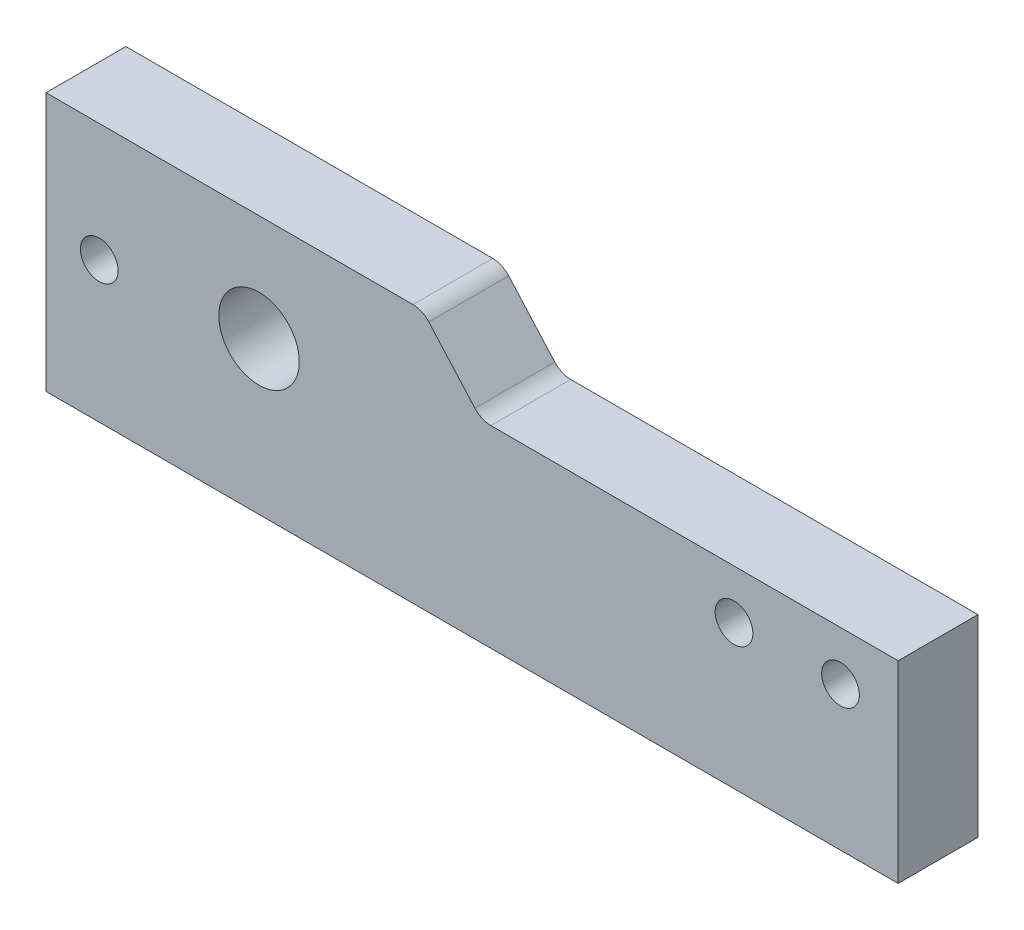
ISO-10303-21;
HEADER;
FILE_DESCRIPTION(('STEP AP214'),'2;1');
FILE_NAME('part.step','',(''),(''),'','','');
FILE_SCHEMA(('AUTOMOTIVE_DESIGN { 1 0 10303 214 1 1 1 1 }'));
ENDSEC;
DATA;
#1=APPLICATION_CONTEXT('core data for automotive mechanical design processes');
#2=APPLICATION_PROTOCOL_DEFINITION('international standard','automotive_design',2000,#1);
#3=PRODUCT_CONTEXT('',#1,'mechanical');
#4=PRODUCT('Part','Part','',(#3));
#5=PRODUCT_RELATED_PRODUCT_CATEGORY('part','',(#4));
#6=PRODUCT_DEFINITION_FORMATION('','',#4);
#7=PRODUCT_DEFINITION_CONTEXT('part definition',#1,'design');
#8=PRODUCT_DEFINITION('design','',#6,#7);
#9=PRODUCT_DEFINITION_SHAPE('','',#8);
#10=(LENGTH_UNIT() NAMED_UNIT(*) SI_UNIT(.MILLI.,.METRE.));
#11=(NAMED_UNIT(*) PLANE_ANGLE_UNIT() SI_UNIT($,.RADIAN.));
#12=(NAMED_UNIT(*) SI_UNIT($,.STERADIAN.) SOLID_ANGLE_UNIT());
#13=UNCERTAINTY_MEASURE_WITH_UNIT(LENGTH_MEASURE(1.E-05),#10,'distance_accuracy_value','');
#14=(GEOMETRIC_REPRESENTATION_CONTEXT(3) GLOBAL_UNCERTAINTY_ASSIGNED_CONTEXT((#13)) GLOBAL_UNIT_ASSIGNED_CONTEXT((#10,
#11,#12)) REPRESENTATION_CONTEXT('',''));
#15=CARTESIAN_POINT('',(0.,0.,0.));
#16=DIRECTION('',(0.,0.,1.));
#17=DIRECTION('',(1.,0.,0.));
#18=AXIS2_PLACEMENT_3D('',#15,#16,#17);
#19=CARTESIAN_POINT('',(-50.8,-22.225,9.525));
#20=DIRECTION('',(1.,0.,0.));
#21=DIRECTION('',(0.,0.,-1.));
#22=AXIS2_PLACEMENT_3D('',#19,#20,#21);
#23=PLANE('',#22);
#24=DIRECTION('',(0.,-1.,0.));
#25=VECTOR('',#24,1.);
#26=CARTESIAN_POINT('',(-50.8,-22.225,0.));
#27=LINE('',#26,#25);
#28=CARTESIAN_POINT('',(-50.8,22.225,0.));
#29=VERTEX_POINT('',#28);
#30=CARTESIAN_POINT('',(-50.8,-8.62651821967252,0.));
#31=VERTEX_POINT('',#30);
#32=EDGE_CURVE('E137',#29,#31,#27,.T.);
#33=ORIENTED_EDGE('',*,*,#32,.T.);
#34=DIRECTION('',(0.,0.,1.));
#35=VECTOR('',#34,1.);
#36=CARTESIAN_POINT('',(-50.8,-8.62651821967252,9.525));
#37=LINE('',#36,#35);
#38=CARTESIAN_POINT('',(-50.8,-8.62651821967252,9.525));
#39=VERTEX_POINT('',#38);
#40=EDGE_CURVE('E177',#31,#39,#37,.T.);
#41=ORIENTED_EDGE('',*,*,#40,.T.);
#42=DIRECTION('',(0.,-1.,0.));
#43=VECTOR('',#42,1.);
#44=CARTESIAN_POINT('',(-50.8,-22.225,9.525));
#45=LINE('',#44,#43);
#46=CARTESIAN_POINT('',(-50.8,22.225,9.525));
#47=VERTEX_POINT('',#46);
#48=EDGE_CURVE('E129',#47,#39,#45,.T.);
#49=ORIENTED_EDGE('',*,*,#48,.F.);
#50=DIRECTION('',(0.,0.,-1.));
#51=VECTOR('',#50,1.);
#52=CARTESIAN_POINT('',(-50.8,22.225,9.525));
#53=LINE('',#52,#51);
#54=EDGE_CURVE('E131',#47,#29,#53,.T.);
#55=ORIENTED_EDGE('',*,*,#54,.T.);
#56=EDGE_LOOP('',(#33,#41,#49,#55));
#57=FACE_BOUND('',#56,.T.);
#58=ADVANCED_FACE('F39',(#57),#23,.F.);
#59=CARTESIAN_POINT('',(50.8,-22.225,9.525));
#60=DIRECTION('',(-1.,0.,0.));
#61=DIRECTION('',(0.,-1.,0.));
#62=AXIS2_PLACEMENT_3D('',#59,#60,#61);
#63=PLANE('',#62);
#64=DIRECTION('',(0.,1.,0.));
#65=VECTOR('',#64,1.);
#66=CARTESIAN_POINT('',(50.8,-22.225,0.));
#67=LINE('',#66,#65);
#68=CARTESIAN_POINT('',(50.8,-8.62651821967252,0.));
#69=VERTEX_POINT('',#68);
#70=CARTESIAN_POINT('',(50.8,14.368885078593,0.));
#71=VERTEX_POINT('',#70);
#72=EDGE_CURVE('E121',#69,#71,#67,.T.);
#73=ORIENTED_EDGE('',*,*,#72,.T.);
#74=DIRECTION('',(0.,0.,-1.));
#75=VECTOR('',#74,1.);
#76=CARTESIAN_POINT('',(50.8000000000708,14.368885078593,9.525));
#77=LINE('',#76,#75);
#78=CARTESIAN_POINT('',(50.8000000000708,14.368885078593,9.525));
#79=VERTEX_POINT('',#78);
#80=EDGE_CURVE('E106',#79,#71,#77,.T.);
#81=ORIENTED_EDGE('',*,*,#80,.F.);
#82=DIRECTION('',(0.,1.,0.));
#83=VECTOR('',#82,1.);
#84=CARTESIAN_POINT('',(50.8,-22.225,9.525));
#85=LINE('',#84,#83);
#86=CARTESIAN_POINT('',(50.8,-8.62651821967252,9.525));
#87=VERTEX_POINT('',#86);
#88=EDGE_CURVE('E119',#87,#79,#85,.T.);
#89=ORIENTED_EDGE('',*,*,#88,.F.);
#90=DIRECTION('',(0.,0.,-1.));
#91=VECTOR('',#90,1.);
#92=CARTESIAN_POINT('',(50.8,-8.62651821967252,9.525));
#93=LINE('',#92,#91);
#94=EDGE_CURVE('E175',#87,#69,#93,.T.);
#95=ORIENTED_EDGE('',*,*,#94,.T.);
#96=EDGE_LOOP('',(#73,#81,#89,#95));
#97=FACE_BOUND('',#96,.T.);
#98=ADVANCED_FACE('F117',(#97),#63,.F.);
#99=CARTESIAN_POINT('',(50.8,22.225,9.525));
#100=DIRECTION('',(0.,-1.,0.));
#101=DIRECTION('',(1.,0.,0.));
#102=AXIS2_PLACEMENT_3D('',#99,#100,#101);
#103=PLANE('',#102);
#104=DIRECTION('',(-1.,0.,0.));
#105=VECTOR('',#104,1.);
#106=CARTESIAN_POINT('',(50.8,22.225,9.525));
#107=LINE('',#106,#105);
#108=CARTESIAN_POINT('',(-7.0499777657056,22.225,9.525));
#109=VERTEX_POINT('',#108);
#110=EDGE_CURVE('E128',#109,#47,#107,.T.);
#111=ORIENTED_EDGE('',*,*,#110,.F.);
#112=DIRECTION('',(0.,0.,-1.));
#113=VECTOR('',#112,1.);
#114=CARTESIAN_POINT('',(-7.0499777657056,22.225,9.525));
#115=LINE('',#114,#113);
#116=CARTESIAN_POINT('',(-7.0499777657056,22.225,0.));
#117=VERTEX_POINT('',#116);
#118=EDGE_CURVE('E148',#109,#117,#115,.T.);
#119=ORIENTED_EDGE('',*,*,#118,.T.);
#120=DIRECTION('',(-1.,0.,0.));
#121=VECTOR('',#120,1.);
#122=CARTESIAN_POINT('',(50.8,22.225,0.));
#123=LINE('',#122,#121);
#124=EDGE_CURVE('E133',#117,#29,#123,.T.);
#125=ORIENTED_EDGE('',*,*,#124,.T.);
#126=ORIENTED_EDGE('',*,*,#54,.F.);
#127=EDGE_LOOP('',(#111,#119,#125,#126));
#128=FACE_BOUND('',#127,.T.);
#129=ADVANCED_FACE('F221',(#128),#103,.F.);
#130=CARTESIAN_POINT('',(0.,0.,9.525));
#131=DIRECTION('',(0.,0.,1.));
#132=DIRECTION('',(1.,0.,0.));
#133=AXIS2_PLACEMENT_3D('',#130,#131,#132);
#134=PLANE('',#133);
#135=CARTESIAN_POINT('',(-44.4499999999996,8.139974193482,9.525));
#136=DIRECTION('',(0.,0.,-1.));
#137=DIRECTION('',(-1.,0.,0.));
#138=AXIS2_PLACEMENT_3D('',#135,#136,#137);
#139=CIRCLE('',#138,2.24789999999999);
#140=CARTESIAN_POINT('',(-46.6978999999996,8.139974193482,9.525));
#141=VERTEX_POINT('',#140);
#142=EDGE_CURVE('E166',#141,#141,#139,.T.);
#143=ORIENTED_EDGE('',*,*,#142,.T.);
#144=EDGE_LOOP('',(#143));
#145=FACE_BOUND('',#144,.T.);
#146=DIRECTION('',(-0.665685747327236,0.746232192956978,0.));
#147=VECTOR('',#146,1.);
#148=CARTESIAN_POINT('',(0.338593076205715,15.2180432803818,9.525));
#149=LINE('',#148,#147);
#150=CARTESIAN_POINT('',(0.338593076205715,15.2180432803818,9.525));
#151=VERTEX_POINT('',#150);
#152=CARTESIAN_POINT('',(-5.15454799559488,21.3758417982112,9.525));
#153=VERTEX_POINT('',#152);
#154=EDGE_CURVE('E111',#151,#153,#149,.T.);
#155=ORIENTED_EDGE('',*,*,#154,.T.);
#156=CARTESIAN_POINT('',(-7.0499777657056,19.685,9.525));
#157=DIRECTION('',(0.,0.,1.));
#158=DIRECTION('',(1.,0.,0.));
#159=AXIS2_PLACEMENT_3D('',#156,#157,#158);
#160=CIRCLE('',#159,2.54);
#161=EDGE_CURVE('E157',#153,#109,#160,.T.);
#162=ORIENTED_EDGE('',*,*,#161,.T.);
#163=ORIENTED_EDGE('',*,*,#110,.T.);
#164=ORIENTED_EDGE('',*,*,#48,.T.);
#165=DIRECTION('',(1.,0.,0.));
#166=VECTOR('',#165,1.);
#167=CARTESIAN_POINT('',(54.8068478606638,-8.62651821967252,9.525));
#168=LINE('',#167,#166);
#169=EDGE_CURVE('E122',#39,#87,#168,.T.);
#170=ORIENTED_EDGE('',*,*,#169,.T.);
#171=ORIENTED_EDGE('',*,*,#88,.T.);
#172=DIRECTION('',(-1.,0.,0.));
#173=VECTOR('',#172,1.);
#174=CARTESIAN_POINT('',(50.8000000000708,14.368885078593,9.525));
#175=LINE('',#174,#173);
#176=CARTESIAN_POINT('',(2.23402284631644,14.368885078593,9.525));
#177=VERTEX_POINT('',#176);
#178=EDGE_CURVE('E103',#79,#177,#175,.T.);
#179=ORIENTED_EDGE('',*,*,#178,.T.);
#180=CARTESIAN_POINT('',(2.23402284631644,16.908885078593,9.525));
#181=DIRECTION('',(0.,0.,1.));
#182=DIRECTION('',(1.,0.,0.));
#183=AXIS2_PLACEMENT_3D('',#180,#181,#182);
#184=CIRCLE('',#183,2.54);
#185=EDGE_CURVE('E11',#177,#151,#184,.F.);
#186=ORIENTED_EDGE('',*,*,#185,.T.);
#187=EDGE_LOOP('',(#155,#162,#163,#164,#170,#171,#179,#186));
#188=FACE_BOUND('',#187,.T.);
#189=CARTESIAN_POINT('',(43.9318140567244,8.51848178032743,9.525));
#190=DIRECTION('',(0.,0.,-1.));
#191=DIRECTION('',(-1.,0.,0.));
#192=AXIS2_PLACEMENT_3D('',#189,#190,#191);
#193=CIRCLE('',#192,2.24789999999999);
#194=CARTESIAN_POINT('',(41.6839140567244,8.51848178032743,9.525));
#195=VERTEX_POINT('',#194);
#196=EDGE_CURVE('E183',#195,#195,#193,.T.);
#197=ORIENTED_EDGE('',*,*,#196,.T.);
#198=EDGE_LOOP('',(#197));
#199=FACE_BOUND('',#198,.T.);
#200=CARTESIAN_POINT('',(31.2318140567244,8.51848178032743,9.525));
#201=DIRECTION('',(0.,0.,-1.));
#202=DIRECTION('',(-1.,0.,0.));
#203=AXIS2_PLACEMENT_3D('',#200,#201,#202);
#204=CIRCLE('',#203,2.24789999999999);
#205=CARTESIAN_POINT('',(28.9839140567244,8.51848178032743,9.525));
#206=VERTEX_POINT('',#205);
#207=EDGE_CURVE('E189',#206,#206,#204,.T.);
#208=ORIENTED_EDGE('',*,*,#207,.T.);
#209=EDGE_LOOP('',(#208));
#210=FACE_BOUND('',#209,.T.);
#211=CARTESIAN_POINT('',(-25.4,9.525,9.525));
#212=DIRECTION('',(0.,0.,1.));
#213=DIRECTION('',(1.,0.,0.));
#214=AXIS2_PLACEMENT_3D('',#211,#212,#213);
#215=CIRCLE('',#214,4.8);
#216=CARTESIAN_POINT('',(-30.2,9.525,9.525));
#217=VERTEX_POINT('',#216);
#218=EDGE_CURVE('E140',#217,#217,#215,.T.);
#219=ORIENTED_EDGE('',*,*,#218,.F.);
#220=EDGE_LOOP('',(#219));
#221=FACE_BOUND('',#220,.T.);
#222=ADVANCED_FACE('F125',(#145,#188,#199,#210,#221),#134,.T.);
#223=CARTESIAN_POINT('',(0.,0.,0.));
#224=DIRECTION('',(0.,0.,1.));
#225=DIRECTION('',(1.,0.,0.));
#226=AXIS2_PLACEMENT_3D('',#223,#224,#225);
#227=PLANE('',#226);
#228=CARTESIAN_POINT('',(-44.4499999999996,8.139974193482,0.));
#229=DIRECTION('',(0.,0.,-1.));
#230=DIRECTION('',(-1.,0.,0.));
#231=AXIS2_PLACEMENT_3D('',#228,#229,#230);
#232=CIRCLE('',#231,2.24789999999999);
#233=CARTESIAN_POINT('',(-46.6978999999996,8.139974193482,0.));
#234=VERTEX_POINT('',#233);
#235=EDGE_CURVE('E258',#234,#234,#232,.T.);
#236=ORIENTED_EDGE('',*,*,#235,.F.);
#237=EDGE_LOOP('',(#236));
#238=FACE_BOUND('',#237,.T.);
#239=CARTESIAN_POINT('',(43.9318140567244,8.51848178032743,0.));
#240=DIRECTION('',(0.,0.,-1.));
#241=DIRECTION('',(-1.,0.,0.));
#242=AXIS2_PLACEMENT_3D('',#239,#240,#241);
#243=CIRCLE('',#242,2.24789999999998);
#244=CARTESIAN_POINT('',(41.6839140567244,8.51848178032743,0.));
#245=VERTEX_POINT('',#244);
#246=EDGE_CURVE('E180',#245,#245,#243,.T.);
#247=ORIENTED_EDGE('',*,*,#246,.F.);
#248=EDGE_LOOP('',(#247));
#249=FACE_BOUND('',#248,.T.);
#250=CARTESIAN_POINT('',(31.2318140567244,8.51848178032743,0.));
#251=DIRECTION('',(0.,0.,-1.));
#252=DIRECTION('',(-1.,0.,0.));
#253=AXIS2_PLACEMENT_3D('',#250,#251,#252);
#254=CIRCLE('',#253,2.24789999999999);
#255=CARTESIAN_POINT('',(28.9839140567244,8.51848178032743,0.));
#256=VERTEX_POINT('',#255);
#257=EDGE_CURVE('E186',#256,#256,#254,.T.);
#258=ORIENTED_EDGE('',*,*,#257,.F.);
#259=EDGE_LOOP('',(#258));
#260=FACE_BOUND('',#259,.T.);
#261=CARTESIAN_POINT('',(-25.4,9.525,0.));
#262=DIRECTION('',(0.,0.,1.));
#263=DIRECTION('',(1.,0.,0.));
#264=AXIS2_PLACEMENT_3D('',#261,#262,#263);
#265=CIRCLE('',#264,4.8);
#266=CARTESIAN_POINT('',(-30.2,9.525,0.));
#267=VERTEX_POINT('',#266);
#268=EDGE_CURVE('E192',#267,#267,#265,.T.);
#269=ORIENTED_EDGE('',*,*,#268,.T.);
#270=EDGE_LOOP('',(#269));
#271=FACE_BOUND('',#270,.T.);
#272=ORIENTED_EDGE('',*,*,#124,.F.);
#273=CARTESIAN_POINT('',(-7.0499777657056,19.685,0.));
#274=DIRECTION('',(0.,0.,1.));
#275=DIRECTION('',(1.,0.,0.));
#276=AXIS2_PLACEMENT_3D('',#273,#274,#275);
#277=CIRCLE('',#276,2.54);
#278=CARTESIAN_POINT('',(-5.15454799559488,21.3758417982112,0.));
#279=VERTEX_POINT('',#278);
#280=EDGE_CURVE('E151',#117,#279,#277,.F.);
#281=ORIENTED_EDGE('',*,*,#280,.T.);
#282=DIRECTION('',(-0.665685747327236,0.746232192956977,0.));
#283=VECTOR('',#282,1.);
#284=CARTESIAN_POINT('',(-6.45132171636736,22.8295221591117,0.));
#285=LINE('',#284,#283);
#286=CARTESIAN_POINT('',(0.338593076205713,15.2180432803818,0.));
#287=VERTEX_POINT('',#286);
#288=EDGE_CURVE('E112',#287,#279,#285,.T.);
#289=ORIENTED_EDGE('',*,*,#288,.F.);
#290=CARTESIAN_POINT('',(2.23402284631644,16.908885078593,0.));
#291=DIRECTION('',(0.,0.,1.));
#292=DIRECTION('',(1.,0.,0.));
#293=AXIS2_PLACEMENT_3D('',#290,#291,#292);
#294=CIRCLE('',#293,2.54);
#295=CARTESIAN_POINT('',(2.23402284631644,14.368885078593,0.));
#296=VERTEX_POINT('',#295);
#297=EDGE_CURVE('E47',#287,#296,#294,.T.);
#298=ORIENTED_EDGE('',*,*,#297,.T.);
#299=DIRECTION('',(-1.,0.,0.));
#300=VECTOR('',#299,1.);
#301=CARTESIAN_POINT('',(50.8000000000708,14.368885078593,0.));
#302=LINE('',#301,#300);
#303=EDGE_CURVE('E163',#71,#296,#302,.T.);
#304=ORIENTED_EDGE('',*,*,#303,.F.);
#305=ORIENTED_EDGE('',*,*,#72,.F.);
#306=DIRECTION('',(-1.,0.,0.));
#307=VECTOR('',#306,1.);
#308=CARTESIAN_POINT('',(0.,-8.62651821967252,0.));
#309=LINE('',#308,#307);
#310=EDGE_CURVE('E145',#69,#31,#309,.T.);
#311=ORIENTED_EDGE('',*,*,#310,.T.);
#312=ORIENTED_EDGE('',*,*,#32,.F.);
#313=EDGE_LOOP('',(#272,#281,#289,#298,#304,#305,#311,#312));
#314=FACE_BOUND('',#313,.T.);
#315=ADVANCED_FACE('F162',(#238,#249,#260,#271,#314),#227,.F.);
#316=CARTESIAN_POINT('',(-25.4,9.525,9.525));
#317=DIRECTION('',(0.,0.,-1.));
#318=DIRECTION('',(-1.,0.,0.));
#319=AXIS2_PLACEMENT_3D('',#316,#317,#318);
#320=CYLINDRICAL_SURFACE('',#319,4.8);
#321=CARTESIAN_POINT('',(-30.2,9.525,9.525));
#322=CARTESIAN_POINT('',(-30.2,9.525,9.42578125));
#323=CARTESIAN_POINT('',(-30.2,9.525,9.3265625));
#324=CARTESIAN_POINT('',(-30.2,9.525,9.128125));
#325=CARTESIAN_POINT('',(-30.2,9.525,9.02890625));
#326=CARTESIAN_POINT('',(-30.2,9.525,8.83046875));
#327=CARTESIAN_POINT('',(-30.2,9.525,8.73125));
#328=CARTESIAN_POINT('',(-30.2,9.525,8.5328125));
#329=CARTESIAN_POINT('',(-30.2,9.525,8.43359375));
#330=CARTESIAN_POINT('',(-30.2,9.525,8.23515625));
#331=CARTESIAN_POINT('',(-30.2,9.525,8.1359375));
#332=CARTESIAN_POINT('',(-30.2,9.525,7.9375));
#333=CARTESIAN_POINT('',(-30.2,9.525,7.83828125));
#334=CARTESIAN_POINT('',(-30.2,9.525,7.63984375));
#335=CARTESIAN_POINT('',(-30.2,9.525,7.540625));
#336=CARTESIAN_POINT('',(-30.2,9.525,7.3421875));
#337=CARTESIAN_POINT('',(-30.2,9.525,7.24296875));
#338=CARTESIAN_POINT('',(-30.2,9.525,7.04453125));
#339=CARTESIAN_POINT('',(-30.2,9.525,6.9453125));
#340=CARTESIAN_POINT('',(-30.2,9.525,6.746875));
#341=CARTESIAN_POINT('',(-30.2,9.525,6.64765625));
#342=CARTESIAN_POINT('',(-30.2,9.525,6.44921875));
#343=CARTESIAN_POINT('',(-30.2,9.525,6.35));
#344=CARTESIAN_POINT('',(-30.2,9.525,6.1515625));
#345=CARTESIAN_POINT('',(-30.2,9.525,6.05234375));
#346=CARTESIAN_POINT('',(-30.2,9.525,5.85390625));
#347=CARTESIAN_POINT('',(-30.2,9.525,5.7546875));
#348=CARTESIAN_POINT('',(-30.2,9.525,5.55625));
#349=CARTESIAN_POINT('',(-30.2,9.525,5.45703125));
#350=CARTESIAN_POINT('',(-30.2,9.525,5.25859375));
#351=CARTESIAN_POINT('',(-30.2,9.525,5.159375));
#352=CARTESIAN_POINT('',(-30.2,9.525,4.9609375));
#353=CARTESIAN_POINT('',(-30.2,9.525,4.86171875));
#354=CARTESIAN_POINT('',(-30.2,9.525,4.66328125));
#355=CARTESIAN_POINT('',(-30.2,9.525,4.5640625));
#356=CARTESIAN_POINT('',(-30.2,9.525,4.365625));
#357=CARTESIAN_POINT('',(-30.2,9.525,4.26640625));
#358=CARTESIAN_POINT('',(-30.2,9.525,4.06796875));
#359=CARTESIAN_POINT('',(-30.2,9.525,3.96875));
#360=CARTESIAN_POINT('',(-30.2,9.525,3.7703125));
#361=CARTESIAN_POINT('',(-30.2,9.525,3.67109375));
#362=CARTESIAN_POINT('',(-30.2,9.525,3.47265625));
#363=CARTESIAN_POINT('',(-30.2,9.525,3.3734375));
#364=CARTESIAN_POINT('',(-30.2,9.525,3.175));
#365=CARTESIAN_POINT('',(-30.2,9.525,3.07578125));
#366=CARTESIAN_POINT('',(-30.2,9.525,2.87734375));
#367=CARTESIAN_POINT('',(-30.2,9.525,2.778125));
#368=CARTESIAN_POINT('',(-30.2,9.525,2.5796875));
#369=CARTESIAN_POINT('',(-30.2,9.525,2.48046875));
#370=CARTESIAN_POINT('',(-30.2,9.525,2.28203125));
#371=CARTESIAN_POINT('',(-30.2,9.525,2.1828125));
#372=CARTESIAN_POINT('',(-30.2,9.525,1.984375));
#373=CARTESIAN_POINT('',(-30.2,9.525,1.88515625));
#374=CARTESIAN_POINT('',(-30.2,9.525,1.68671875));
#375=CARTESIAN_POINT('',(-30.2,9.525,1.5875));
#376=CARTESIAN_POINT('',(-30.2,9.525,1.3890625));
#377=CARTESIAN_POINT('',(-30.2,9.525,1.28984375));
#378=CARTESIAN_POINT('',(-30.2,9.525,1.09140625));
#379=CARTESIAN_POINT('',(-30.2,9.525,0.992187500000001));
#380=CARTESIAN_POINT('',(-30.2,9.525,0.793750000000001));
#381=CARTESIAN_POINT('',(-30.2,9.525,0.69453125));
#382=CARTESIAN_POINT('',(-30.2,9.525,0.49609375));
#383=CARTESIAN_POINT('',(-30.2,9.525,0.396875));
#384=CARTESIAN_POINT('',(-30.2,9.525,0.1984375));
#385=CARTESIAN_POINT('',(-30.2,9.525,0.0992187500000001));
#386=CARTESIAN_POINT('',(-30.2,9.525,0.));
#387=B_SPLINE_CURVE_WITH_KNOTS('',3,(#321,#322,#323,#324,#325,#326,#327,#328,#329,#330,#331,
#332,#333,#334,#335,#336,#337,#338,#339,#340,#341,#342,#343,#344,#345,#346,#347,#348,#349,#350,
#351,#352,#353,#354,#355,#356,#357,#358,#359,#360,#361,#362,#363,#364,#365,#366,#367,#368,#369,
#370,#371,#372,#373,#374,#375,#376,#377,#378,#379,#380,#381,#382,#383,#384,#385,#386),
.UNSPECIFIED.,.F.,.F.,(4,2,2,2,2,2,2,2,2,2,2,2,2,2,2,2,2,2,2,2,2,2,2,2,2,2,2,2,2,2,2,2,4),(0.,
0.29765625,0.5953125,0.892968750000001,1.190625,1.48828125,1.7859375,2.08359375,2.38125,
2.67890625,2.9765625,3.27421875,3.571875,3.86953125,4.1671875,4.46484375,4.7625,5.06015625,
5.3578125,5.65546875,5.953125,6.25078125,6.5484375,6.84609375,7.14375,7.44140625,7.7390625,
8.03671875,8.334375,8.63203125,8.9296875,9.22734375,9.525),.UNSPECIFIED.);
#388=EDGE_CURVE('BSEAM198',#217,#267,#387,.T.);
#389=ORIENTED_EDGE('',*,*,#218,.T.);
#390=ORIENTED_EDGE('',*,*,#268,.F.);
#391=ORIENTED_EDGE('',*,*,#388,.T.);
#392=ORIENTED_EDGE('',*,*,#388,.F.);
#393=EDGE_LOOP('',(#389,#391,#390,#392));
#394=FACE_BOUND('',#393,.T.);
#395=ADVANCED_FACE('F198',(#394),#320,.F.);
#396=CARTESIAN_POINT('',(31.2318140567244,8.51848178032743,0.));
#397=DIRECTION('',(0.,0.,-1.));
#398=DIRECTION('',(-1.,0.,0.));
#399=AXIS2_PLACEMENT_3D('',#396,#397,#398);
#400=CYLINDRICAL_SURFACE('',#399,2.24789999999999);
#401=ORIENTED_EDGE('',*,*,#207,.F.);
#402=EDGE_LOOP('',(#401));
#403=FACE_BOUND('',#402,.T.);
#404=ORIENTED_EDGE('',*,*,#257,.T.);
#405=EDGE_LOOP('',(#404));
#406=FACE_BOUND('',#405,.T.);
#407=ADVANCED_FACE('F200',(#403,#406),#400,.F.);
#408=CARTESIAN_POINT('',(43.9318140567244,8.51848178032743,0.));
#409=DIRECTION('',(0.,0.,-1.));
#410=DIRECTION('',(-1.,0.,0.));
#411=AXIS2_PLACEMENT_3D('',#408,#409,#410);
#412=CYLINDRICAL_SURFACE('',#411,2.24789999999999);
#413=ORIENTED_EDGE('',*,*,#196,.F.);
#414=EDGE_LOOP('',(#413));
#415=FACE_BOUND('',#414,.T.);
#416=ORIENTED_EDGE('',*,*,#246,.T.);
#417=EDGE_LOOP('',(#416));
#418=FACE_BOUND('',#417,.T.);
#419=ADVANCED_FACE('F206',(#415,#418),#412,.F.);
#420=CARTESIAN_POINT('',(54.8068478606638,-8.62651821967252,9.525));
#421=DIRECTION('',(0.,1.,0.));
#422=DIRECTION('',(0.,0.,1.));
#423=AXIS2_PLACEMENT_3D('',#420,#421,#422);
#424=PLANE('',#423);
#425=ORIENTED_EDGE('',*,*,#310,.F.);
#426=ORIENTED_EDGE('',*,*,#94,.F.);
#427=ORIENTED_EDGE('',*,*,#169,.F.);
#428=ORIENTED_EDGE('',*,*,#40,.F.);
#429=EDGE_LOOP('',(#425,#426,#427,#428));
#430=FACE_BOUND('',#429,.T.);
#431=ADVANCED_FACE('F240',(#430),#424,.F.);
#432=CARTESIAN_POINT('',(-6.45132171636736,22.8295221591117,9.525));
#433=DIRECTION('',(-0.746232192956977,-0.665685747327236,0.));
#434=DIRECTION('',(0.665685747327236,-0.746232192956977,0.));
#435=AXIS2_PLACEMENT_3D('',#432,#433,#434);
#436=PLANE('',#435);
#437=ORIENTED_EDGE('',*,*,#288,.T.);
#438=DIRECTION('',(0.,0.,-1.));
#439=VECTOR('',#438,1.);
#440=CARTESIAN_POINT('',(-5.15454799559488,21.3758417982112,9.525));
#441=LINE('',#440,#439);
#442=EDGE_CURVE('E62',#279,#153,#441,.F.);
#443=ORIENTED_EDGE('',*,*,#442,.T.);
#444=ORIENTED_EDGE('',*,*,#154,.F.);
#445=DIRECTION('',(0.,0.,-1.));
#446=VECTOR('',#445,1.);
#447=CARTESIAN_POINT('',(0.338593076205715,15.2180432803818,0.));
#448=LINE('',#447,#446);
#449=EDGE_CURVE('E153',#151,#287,#448,.T.);
#450=ORIENTED_EDGE('',*,*,#449,.T.);
#451=EDGE_LOOP('',(#437,#443,#444,#450));
#452=FACE_BOUND('',#451,.T.);
#453=ADVANCED_FACE('F169',(#452),#436,.F.);
#454=CARTESIAN_POINT('',(50.8000000000708,14.368885078593,9.525));
#455=DIRECTION('',(0.,-1.,0.));
#456=DIRECTION('',(0.,0.,-1.));
#457=AXIS2_PLACEMENT_3D('',#454,#455,#456);
#458=PLANE('',#457);
#459=ORIENTED_EDGE('',*,*,#303,.T.);
#460=DIRECTION('',(0.,0.,-1.));
#461=VECTOR('',#460,1.);
#462=CARTESIAN_POINT('',(2.23402284631644,14.368885078593,9.525));
#463=LINE('',#462,#461);
#464=EDGE_CURVE('E54',#296,#177,#463,.F.);
#465=ORIENTED_EDGE('',*,*,#464,.T.);
#466=ORIENTED_EDGE('',*,*,#178,.F.);
#467=ORIENTED_EDGE('',*,*,#80,.T.);
#468=EDGE_LOOP('',(#459,#465,#466,#467));
#469=FACE_BOUND('',#468,.T.);
#470=ADVANCED_FACE('F105',(#469),#458,.F.);
#471=CARTESIAN_POINT('',(-7.0499777657056,19.685,9.525));
#472=DIRECTION('',(0.,0.,-1.));
#473=DIRECTION('',(-1.,0.,0.));
#474=AXIS2_PLACEMENT_3D('',#471,#472,#473);
#475=CYLINDRICAL_SURFACE('',#474,2.54);
#476=ORIENTED_EDGE('',*,*,#161,.F.);
#477=ORIENTED_EDGE('',*,*,#442,.F.);
#478=ORIENTED_EDGE('',*,*,#280,.F.);
#479=ORIENTED_EDGE('',*,*,#118,.F.);
#480=EDGE_LOOP('',(#476,#477,#478,#479));
#481=FACE_BOUND('',#480,.T.);
#482=ADVANCED_FACE('F224',(#481),#475,.T.);
#483=CARTESIAN_POINT('',(2.23402284631644,16.908885078593,9.525));
#484=DIRECTION('',(0.,0.,1.));
#485=DIRECTION('',(1.,0.,0.));
#486=AXIS2_PLACEMENT_3D('',#483,#484,#485);
#487=CYLINDRICAL_SURFACE('',#486,2.54);
#488=ORIENTED_EDGE('',*,*,#185,.F.);
#489=ORIENTED_EDGE('',*,*,#464,.F.);
#490=ORIENTED_EDGE('',*,*,#297,.F.);
#491=ORIENTED_EDGE('',*,*,#449,.F.);
#492=EDGE_LOOP('',(#488,#489,#490,#491));
#493=FACE_BOUND('',#492,.T.);
#494=ADVANCED_FACE('F41',(#493),#487,.F.);
#495=CARTESIAN_POINT('',(-44.4499999999996,8.139974193482,9.525));
#496=DIRECTION('',(0.,0.,-1.));
#497=DIRECTION('',(-1.,0.,0.));
#498=AXIS2_PLACEMENT_3D('',#495,#496,#497);
#499=CYLINDRICAL_SURFACE('',#498,2.24789999999999);
#500=CARTESIAN_POINT('',(-46.6978999999996,8.139974193482,9.525));
#501=CARTESIAN_POINT('',(-46.6978999999996,8.139974193482,9.42578125));
#502=CARTESIAN_POINT('',(-46.6978999999996,8.139974193482,9.3265625));
#503=CARTESIAN_POINT('',(-46.6978999999996,8.139974193482,9.128125));
#504=CARTESIAN_POINT('',(-46.6978999999996,8.139974193482,9.02890625));
#505=CARTESIAN_POINT('',(-46.6978999999996,8.139974193482,8.83046875));
#506=CARTESIAN_POINT('',(-46.6978999999996,8.139974193482,8.73125));
#507=CARTESIAN_POINT('',(-46.6978999999996,8.139974193482,8.5328125));
#508=CARTESIAN_POINT('',(-46.6978999999996,8.139974193482,8.43359375));
#509=CARTESIAN_POINT('',(-46.6978999999996,8.139974193482,8.23515625));
#510=CARTESIAN_POINT('',(-46.6978999999996,8.139974193482,8.1359375));
#511=CARTESIAN_POINT('',(-46.6978999999996,8.139974193482,7.9375));
#512=CARTESIAN_POINT('',(-46.6978999999996,8.139974193482,7.83828125));
#513=CARTESIAN_POINT('',(-46.6978999999996,8.139974193482,7.63984375));
#514=CARTESIAN_POINT('',(-46.6978999999996,8.139974193482,7.540625));
#515=CARTESIAN_POINT('',(-46.6978999999996,8.139974193482,7.3421875));
#516=CARTESIAN_POINT('',(-46.6978999999996,8.139974193482,7.24296875));
#517=CARTESIAN_POINT('',(-46.6978999999996,8.139974193482,7.04453125));
#518=CARTESIAN_POINT('',(-46.6978999999996,8.139974193482,6.9453125));
#519=CARTESIAN_POINT('',(-46.6978999999996,8.139974193482,6.746875));
#520=CARTESIAN_POINT('',(-46.6978999999996,8.139974193482,6.64765625));
#521=CARTESIAN_POINT('',(-46.6978999999996,8.139974193482,6.44921875));
#522=CARTESIAN_POINT('',(-46.6978999999996,8.139974193482,6.35));
#523=CARTESIAN_POINT('',(-46.6978999999996,8.139974193482,6.1515625));
#524=CARTESIAN_POINT('',(-46.6978999999996,8.139974193482,6.05234375));
#525=CARTESIAN_POINT('',(-46.6978999999996,8.139974193482,5.85390625));
#526=CARTESIAN_POINT('',(-46.6978999999996,8.139974193482,5.7546875));
#527=CARTESIAN_POINT('',(-46.6978999999996,8.139974193482,5.55625));
#528=CARTESIAN_POINT('',(-46.6978999999996,8.139974193482,5.45703125));
#529=CARTESIAN_POINT('',(-46.6978999999996,8.139974193482,5.25859375));
#530=CARTESIAN_POINT('',(-46.6978999999996,8.139974193482,5.159375));
#531=CARTESIAN_POINT('',(-46.6978999999996,8.139974193482,4.9609375));
#532=CARTESIAN_POINT('',(-46.6978999999996,8.139974193482,4.86171875));
#533=CARTESIAN_POINT('',(-46.6978999999996,8.139974193482,4.66328125));
#534=CARTESIAN_POINT('',(-46.6978999999996,8.139974193482,4.5640625));
#535=CARTESIAN_POINT('',(-46.6978999999996,8.139974193482,4.365625));
#536=CARTESIAN_POINT('',(-46.6978999999996,8.139974193482,4.26640625));
#537=CARTESIAN_POINT('',(-46.6978999999996,8.139974193482,4.06796875));
#538=CARTESIAN_POINT('',(-46.6978999999996,8.139974193482,3.96875));
#539=CARTESIAN_POINT('',(-46.6978999999996,8.139974193482,3.7703125));
#540=CARTESIAN_POINT('',(-46.6978999999996,8.139974193482,3.67109375));
#541=CARTESIAN_POINT('',(-46.6978999999996,8.139974193482,3.47265625));
#542=CARTESIAN_POINT('',(-46.6978999999996,8.139974193482,3.3734375));
#543=CARTESIAN_POINT('',(-46.6978999999996,8.139974193482,3.175));
#544=CARTESIAN_POINT('',(-46.6978999999996,8.139974193482,3.07578125));
#545=CARTESIAN_POINT('',(-46.6978999999996,8.139974193482,2.87734375));
#546=CARTESIAN_POINT('',(-46.6978999999996,8.139974193482,2.778125));
#547=CARTESIAN_POINT('',(-46.6978999999996,8.139974193482,2.5796875));
#548=CARTESIAN_POINT('',(-46.6978999999996,8.139974193482,2.48046875));
#549=CARTESIAN_POINT('',(-46.6978999999996,8.139974193482,2.28203125));
#550=CARTESIAN_POINT('',(-46.6978999999996,8.139974193482,2.1828125));
#551=CARTESIAN_POINT('',(-46.6978999999996,8.139974193482,1.984375));
#552=CARTESIAN_POINT('',(-46.6978999999996,8.139974193482,1.88515625));
#553=CARTESIAN_POINT('',(-46.6978999999996,8.139974193482,1.68671875));
#554=CARTESIAN_POINT('',(-46.6978999999996,8.139974193482,1.5875));
#555=CARTESIAN_POINT('',(-46.6978999999996,8.139974193482,1.3890625));
#556=CARTESIAN_POINT('',(-46.6978999999996,8.139974193482,1.28984375));
#557=CARTESIAN_POINT('',(-46.6978999999996,8.139974193482,1.09140625));
#558=CARTESIAN_POINT('',(-46.6978999999996,8.139974193482,0.992187500000001));
#559=CARTESIAN_POINT('',(-46.6978999999996,8.139974193482,0.793750000000001));
#560=CARTESIAN_POINT('',(-46.6978999999996,8.139974193482,0.69453125));
#561=CARTESIAN_POINT('',(-46.6978999999996,8.139974193482,0.49609375));
#562=CARTESIAN_POINT('',(-46.6978999999996,8.139974193482,0.396875));
#563=CARTESIAN_POINT('',(-46.6978999999996,8.139974193482,0.1984375));
#564=CARTESIAN_POINT('',(-46.6978999999996,8.139974193482,0.0992187500000001));
#565=CARTESIAN_POINT('',(-46.6978999999996,8.139974193482,0.));
#566=B_SPLINE_CURVE_WITH_KNOTS('',3,(#500,#501,#502,#503,#504,#505,#506,#507,#508,#509,#510,
#511,#512,#513,#514,#515,#516,#517,#518,#519,#520,#521,#522,#523,#524,#525,#526,#527,#528,#529,
#530,#531,#532,#533,#534,#535,#536,#537,#538,#539,#540,#541,#542,#543,#544,#545,#546,#547,#548,
#549,#550,#551,#552,#553,#554,#555,#556,#557,#558,#559,#560,#561,#562,#563,#564,#565),
.UNSPECIFIED.,.F.,.F.,(4,2,2,2,2,2,2,2,2,2,2,2,2,2,2,2,2,2,2,2,2,2,2,2,2,2,2,2,2,2,2,2,4),(0.,
0.29765625,0.5953125,0.892968750000001,1.190625,1.48828125,1.7859375,2.08359375,2.38125,
2.67890625,2.9765625,3.27421875,3.571875,3.86953125,4.1671875,4.46484375,4.7625,5.06015625,
5.3578125,5.65546875,5.953125,6.25078125,6.5484375,6.84609375,7.14375,7.44140625,7.7390625,
8.03671875,8.334375,8.63203125,8.9296875,9.22734375,9.525),.UNSPECIFIED.);
#567=EDGE_CURVE('BSEAM231',#141,#234,#566,.T.);
#568=ORIENTED_EDGE('',*,*,#142,.F.);
#569=ORIENTED_EDGE('',*,*,#235,.T.);
#570=ORIENTED_EDGE('',*,*,#567,.T.);
#571=ORIENTED_EDGE('',*,*,#567,.F.);
#572=EDGE_LOOP('',(#568,#570,#569,#571));
#573=FACE_BOUND('',#572,.T.);
#574=ADVANCED_FACE('F231',(#573),#499,.F.);
#575=CLOSED_SHELL('',(#58,#98,#129,#222,#315,#395,#407,#419,#431,#453,#470,#482,#494,#574));
#576=MANIFOLD_SOLID_BREP('B2',#575);
#577=ADVANCED_BREP_SHAPE_REPRESENTATION('',(#18,#576),#14);
#578=SHAPE_DEFINITION_REPRESENTATION(#9,#577);
ENDSEC;
END-ISO-10303-21;
